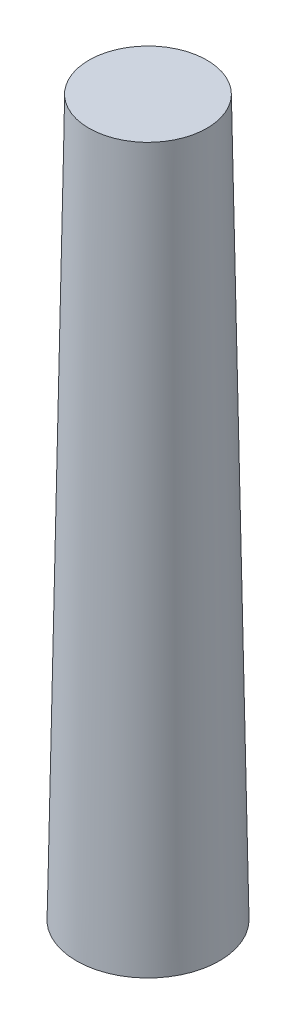
ISO-10303-21;
HEADER;
FILE_DESCRIPTION(('STEP AP214'),'2;1');
FILE_NAME('part.step','',(''),(''),'','','');
FILE_SCHEMA(('AUTOMOTIVE_DESIGN { 1 0 10303 214 1 1 1 1 }'));
ENDSEC;
DATA;
#1=APPLICATION_CONTEXT('core data for automotive mechanical design processes');
#2=APPLICATION_PROTOCOL_DEFINITION('international standard','automotive_design',2000,#1);
#3=PRODUCT_CONTEXT('',#1,'mechanical');
#4=PRODUCT('Part','Part','',(#3));
#5=PRODUCT_RELATED_PRODUCT_CATEGORY('part','',(#4));
#6=PRODUCT_DEFINITION_FORMATION('','',#4);
#7=PRODUCT_DEFINITION_CONTEXT('part definition',#1,'design');
#8=PRODUCT_DEFINITION('design','',#6,#7);
#9=PRODUCT_DEFINITION_SHAPE('','',#8);
#10=(LENGTH_UNIT() NAMED_UNIT(*) SI_UNIT(.MILLI.,.METRE.));
#11=(NAMED_UNIT(*) PLANE_ANGLE_UNIT() SI_UNIT($,.RADIAN.));
#12=(NAMED_UNIT(*) SI_UNIT($,.STERADIAN.) SOLID_ANGLE_UNIT());
#13=UNCERTAINTY_MEASURE_WITH_UNIT(LENGTH_MEASURE(1.E-05),#10,'distance_accuracy_value','');
#14=(GEOMETRIC_REPRESENTATION_CONTEXT(3) GLOBAL_UNCERTAINTY_ASSIGNED_CONTEXT((#13)) GLOBAL_UNIT_ASSIGNED_CONTEXT((#10,
#11,#12)) REPRESENTATION_CONTEXT('',''));
#15=CARTESIAN_POINT('',(0.,0.,0.));
#16=DIRECTION('',(0.,0.,1.));
#17=DIRECTION('',(1.,0.,0.));
#18=AXIS2_PLACEMENT_3D('',#15,#16,#17);
#19=CARTESIAN_POINT('',(0.,0.,0.));
#20=DIRECTION('',(0.,-1.,0.));
#21=DIRECTION('',(0.,0.,1.));
#22=AXIS2_PLACEMENT_3D('',#19,#20,#21);
#23=CONICAL_SURFACE('',#22,1.,0.0174532925199433);
#24=CARTESIAN_POINT('',(0.,10.,0.));
#25=DIRECTION('',(0.,1.,0.));
#26=DIRECTION('',(0.,0.,1.));
#27=AXIS2_PLACEMENT_3D('',#24,#25,#26);
#28=CIRCLE('',#27,0.825449350717824);
#29=CARTESIAN_POINT('',(0.,10.,0.825449350717824));
#30=VERTEX_POINT('',#29);
#31=EDGE_CURVE('E10',#30,#30,#28,.T.);
#32=ORIENTED_EDGE('',*,*,#31,.F.);
#33=EDGE_LOOP('',(#32));
#34=FACE_BOUND('',#33,.T.);
#35=CARTESIAN_POINT('',(0.,0.,0.));
#36=DIRECTION('',(0.,1.,0.));
#37=DIRECTION('',(0.,0.,1.));
#38=AXIS2_PLACEMENT_3D('',#35,#36,#37);
#39=CIRCLE('',#38,1.);
#40=CARTESIAN_POINT('',(0.,0.,1.));
#41=VERTEX_POINT('',#40);
#42=EDGE_CURVE('E44',#41,#41,#39,.T.);
#43=ORIENTED_EDGE('',*,*,#42,.T.);
#44=EDGE_LOOP('',(#43));
#45=FACE_BOUND('',#44,.T.);
#46=ADVANCED_FACE('F37',(#34,#45),#23,.T.);
#47=CARTESIAN_POINT('',(0.,10.,0.));
#48=DIRECTION('',(0.,1.,0.));
#49=DIRECTION('',(0.,0.,1.));
#50=AXIS2_PLACEMENT_3D('',#47,#48,#49);
#51=PLANE('',#50);
#52=ORIENTED_EDGE('',*,*,#31,.T.);
#53=EDGE_LOOP('',(#52));
#54=FACE_BOUND('',#53,.T.);
#55=ADVANCED_FACE('F54',(#54),#51,.T.);
#56=CARTESIAN_POINT('',(0.,0.,0.));
#57=DIRECTION('',(0.,1.,0.));
#58=DIRECTION('',(0.,0.,1.));
#59=AXIS2_PLACEMENT_3D('',#56,#57,#58);
#60=PLANE('',#59);
#61=ORIENTED_EDGE('',*,*,#42,.F.);
#62=EDGE_LOOP('',(#61));
#63=FACE_BOUND('',#62,.T.);
#64=ADVANCED_FACE('F52',(#63),#60,.F.);
#65=CLOSED_SHELL('',(#46,#55,#64));
#66=MANIFOLD_SOLID_BREP('B2',#65);
#67=ADVANCED_BREP_SHAPE_REPRESENTATION('',(#18,#66),#14);
#68=SHAPE_DEFINITION_REPRESENTATION(#9,#67);
ENDSEC;
END-ISO-10303-21;
